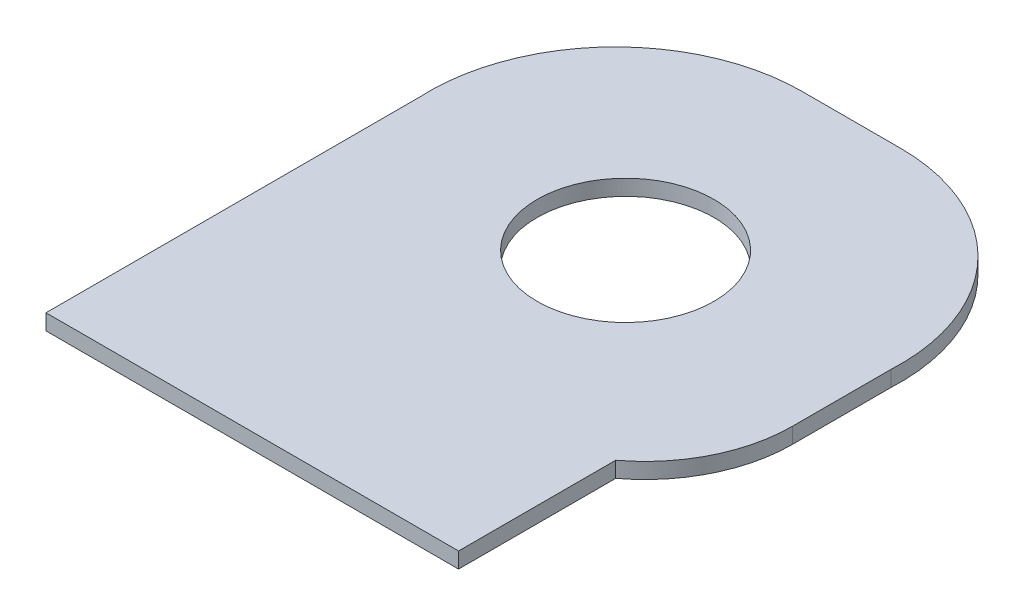
ISO-10303-21;
HEADER;
FILE_DESCRIPTION(('STEP AP214'),'2;1');
FILE_NAME('part.step','',(''),(''),'','','');
FILE_SCHEMA(('AUTOMOTIVE_DESIGN { 1 0 10303 214 1 1 1 1 }'));
ENDSEC;
DATA;
#1=APPLICATION_CONTEXT('core data for automotive mechanical design processes');
#2=APPLICATION_PROTOCOL_DEFINITION('international standard','automotive_design',2000,#1);
#3=PRODUCT_CONTEXT('',#1,'mechanical');
#4=PRODUCT('Part','Part','',(#3));
#5=PRODUCT_RELATED_PRODUCT_CATEGORY('part','',(#4));
#6=PRODUCT_DEFINITION_FORMATION('','',#4);
#7=PRODUCT_DEFINITION_CONTEXT('part definition',#1,'design');
#8=PRODUCT_DEFINITION('design','',#6,#7);
#9=PRODUCT_DEFINITION_SHAPE('','',#8);
#10=(LENGTH_UNIT() NAMED_UNIT(*) SI_UNIT(.MILLI.,.METRE.));
#11=(NAMED_UNIT(*) PLANE_ANGLE_UNIT() SI_UNIT($,.RADIAN.));
#12=(NAMED_UNIT(*) SI_UNIT($,.STERADIAN.) SOLID_ANGLE_UNIT());
#13=UNCERTAINTY_MEASURE_WITH_UNIT(LENGTH_MEASURE(1.E-05),#10,'distance_accuracy_value','');
#14=(GEOMETRIC_REPRESENTATION_CONTEXT(3) GLOBAL_UNCERTAINTY_ASSIGNED_CONTEXT((#13)) GLOBAL_UNIT_ASSIGNED_CONTEXT((#10,
#11,#12)) REPRESENTATION_CONTEXT('',''));
#15=CARTESIAN_POINT('',(0.,0.,0.));
#16=DIRECTION('',(0.,0.,1.));
#17=DIRECTION('',(1.,0.,0.));
#18=AXIS2_PLACEMENT_3D('',#15,#16,#17);
#19=CARTESIAN_POINT('',(-5.,1.6,-9.975));
#20=DIRECTION('',(0.,1.,0.));
#21=DIRECTION('',(0.,0.,1.));
#22=AXIS2_PLACEMENT_3D('',#19,#20,#21);
#23=PLANE('',#22);
#24=CARTESIAN_POINT('',(-5.,1.6,-9.975));
#25=DIRECTION('',(0.,1.,0.));
#26=DIRECTION('',(0.,0.,1.));
#27=AXIS2_PLACEMENT_3D('',#24,#25,#26);
#28=CIRCLE('',#27,19.025);
#29=CARTESIAN_POINT('',(-5.,1.6,-29.));
#30=VERTEX_POINT('',#29);
#31=CARTESIAN_POINT('',(-24.,1.6,-9.));
#32=VERTEX_POINT('',#31);
#33=EDGE_CURVE('E144',#30,#32,#28,.T.);
#34=ORIENTED_EDGE('',*,*,#33,.T.);
#35=DIRECTION('',(0.,0.,1.));
#36=VECTOR('',#35,1.);
#37=CARTESIAN_POINT('',(-24.,1.6,-9.));
#38=LINE('',#37,#36);
#39=CARTESIAN_POINT('',(-24.,1.6,29.));
#40=VERTEX_POINT('',#39);
#41=EDGE_CURVE('E92',#32,#40,#38,.T.);
#42=ORIENTED_EDGE('',*,*,#41,.T.);
#43=DIRECTION('',(1.,0.,0.));
#44=VECTOR('',#43,1.);
#45=CARTESIAN_POINT('',(-24.,1.6,29.));
#46=LINE('',#45,#44);
#47=CARTESIAN_POINT('',(18.,1.6,29.));
#48=VERTEX_POINT('',#47);
#49=EDGE_CURVE('E159',#40,#48,#46,.T.);
#50=ORIENTED_EDGE('',*,*,#49,.T.);
#51=DIRECTION('',(0.,0.,-1.));
#52=VECTOR('',#51,1.);
#53=CARTESIAN_POINT('',(18.,1.6,29.));
#54=LINE('',#53,#52);
#55=CARTESIAN_POINT('',(18.,1.6,13.));
#56=VERTEX_POINT('',#55);
#57=EDGE_CURVE('E172',#48,#56,#54,.T.);
#58=ORIENTED_EDGE('',*,*,#57,.T.);
#59=CARTESIAN_POINT('',(8.99999999999997,1.6,0.99999999999999));
#60=DIRECTION('',(0.,1.,0.));
#61=DIRECTION('',(0.,0.,-1.));
#62=AXIS2_PLACEMENT_3D('',#59,#60,#61);
#63=CIRCLE('',#62,15.);
#64=CARTESIAN_POINT('',(24.,1.6,0.999999999999996));
#65=VERTEX_POINT('',#64);
#66=EDGE_CURVE('E111',#56,#65,#63,.T.);
#67=ORIENTED_EDGE('',*,*,#66,.T.);
#68=DIRECTION('',(0.,0.,-1.));
#69=VECTOR('',#68,1.);
#70=CARTESIAN_POINT('',(24.,1.6,0.999999999999997));
#71=LINE('',#70,#69);
#72=CARTESIAN_POINT('',(24.,1.6,-9.));
#73=VERTEX_POINT('',#72);
#74=EDGE_CURVE('E105',#65,#73,#71,.T.);
#75=ORIENTED_EDGE('',*,*,#74,.T.);
#76=CARTESIAN_POINT('',(5.,1.6,-9.97500000000001));
#77=DIRECTION('',(0.,1.,0.));
#78=DIRECTION('',(0.,0.,-1.));
#79=AXIS2_PLACEMENT_3D('',#76,#77,#78);
#80=CIRCLE('',#79,19.025);
#81=CARTESIAN_POINT('',(5.,1.6,-29.));
#82=VERTEX_POINT('',#81);
#83=EDGE_CURVE('E109',#73,#82,#80,.T.);
#84=ORIENTED_EDGE('',*,*,#83,.T.);
#85=DIRECTION('',(-1.,0.,0.));
#86=VECTOR('',#85,1.);
#87=CARTESIAN_POINT('',(-5.,1.6,-29.));
#88=LINE('',#87,#86);
#89=EDGE_CURVE('E49',#82,#30,#88,.T.);
#90=ORIENTED_EDGE('',*,*,#89,.T.);
#91=EDGE_LOOP('',(#34,#42,#50,#58,#67,#75,#84,#90));
#92=FACE_BOUND('',#91,.T.);
#93=CARTESIAN_POINT('',(0.,1.6,-6.));
#94=DIRECTION('',(0.,1.,0.));
#95=DIRECTION('',(0.,0.,1.));
#96=AXIS2_PLACEMENT_3D('',#93,#94,#95);
#97=CIRCLE('',#96,8.99999999999999);
#98=CARTESIAN_POINT('',(0.,1.6,2.99999999999999));
#99=VERTEX_POINT('',#98);
#100=EDGE_CURVE('E133',#99,#99,#97,.T.);
#101=ORIENTED_EDGE('',*,*,#100,.F.);
#102=EDGE_LOOP('',(#101));
#103=FACE_BOUND('',#102,.T.);
#104=ADVANCED_FACE('F32',(#92,#103),#23,.T.);
#105=CARTESIAN_POINT('',(-5.,0.,-9.975));
#106=DIRECTION('',(0.,1.,0.));
#107=DIRECTION('',(0.,0.,1.));
#108=AXIS2_PLACEMENT_3D('',#105,#106,#107);
#109=PLANE('',#108);
#110=CARTESIAN_POINT('',(-5.,0.,-9.975));
#111=DIRECTION('',(0.,1.,0.));
#112=DIRECTION('',(0.,0.,1.));
#113=AXIS2_PLACEMENT_3D('',#110,#111,#112);
#114=CIRCLE('',#113,19.025);
#115=CARTESIAN_POINT('',(-5.,0.,-29.));
#116=VERTEX_POINT('',#115);
#117=CARTESIAN_POINT('',(-24.,0.,-9.));
#118=VERTEX_POINT('',#117);
#119=EDGE_CURVE('E129',#116,#118,#114,.T.);
#120=ORIENTED_EDGE('',*,*,#119,.F.);
#121=DIRECTION('',(-1.,0.,0.));
#122=VECTOR('',#121,1.);
#123=CARTESIAN_POINT('',(-5.,0.,-29.));
#124=LINE('',#123,#122);
#125=CARTESIAN_POINT('',(5.,0.,-29.));
#126=VERTEX_POINT('',#125);
#127=EDGE_CURVE('E84',#126,#116,#124,.T.);
#128=ORIENTED_EDGE('',*,*,#127,.F.);
#129=CARTESIAN_POINT('',(5.,0.,-9.97500000000001));
#130=DIRECTION('',(0.,1.,0.));
#131=DIRECTION('',(0.,0.,-1.));
#132=AXIS2_PLACEMENT_3D('',#129,#130,#131);
#133=CIRCLE('',#132,19.025);
#134=CARTESIAN_POINT('',(24.,0.,-9.));
#135=VERTEX_POINT('',#134);
#136=EDGE_CURVE('E78',#135,#126,#133,.T.);
#137=ORIENTED_EDGE('',*,*,#136,.F.);
#138=DIRECTION('',(0.,0.,-1.));
#139=VECTOR('',#138,1.);
#140=CARTESIAN_POINT('',(24.,0.,0.999999999999997));
#141=LINE('',#140,#139);
#142=CARTESIAN_POINT('',(24.,0.,0.999999999999996));
#143=VERTEX_POINT('',#142);
#144=EDGE_CURVE('E119',#143,#135,#141,.T.);
#145=ORIENTED_EDGE('',*,*,#144,.F.);
#146=CARTESIAN_POINT('',(8.99999999999997,0.,0.99999999999999));
#147=DIRECTION('',(0.,1.,0.));
#148=DIRECTION('',(0.,0.,-1.));
#149=AXIS2_PLACEMENT_3D('',#146,#147,#148);
#150=CIRCLE('',#149,15.);
#151=CARTESIAN_POINT('',(18.,0.,13.));
#152=VERTEX_POINT('',#151);
#153=EDGE_CURVE('E139',#152,#143,#150,.T.);
#154=ORIENTED_EDGE('',*,*,#153,.F.);
#155=DIRECTION('',(0.,0.,-1.));
#156=VECTOR('',#155,1.);
#157=CARTESIAN_POINT('',(18.,0.,29.));
#158=LINE('',#157,#156);
#159=CARTESIAN_POINT('',(18.,0.,29.));
#160=VERTEX_POINT('',#159);
#161=EDGE_CURVE('E137',#160,#152,#158,.T.);
#162=ORIENTED_EDGE('',*,*,#161,.F.);
#163=DIRECTION('',(1.,0.,0.));
#164=VECTOR('',#163,1.);
#165=CARTESIAN_POINT('',(-24.,0.,29.));
#166=LINE('',#165,#164);
#167=CARTESIAN_POINT('',(-24.,0.,29.));
#168=VERTEX_POINT('',#167);
#169=EDGE_CURVE('E135',#168,#160,#166,.T.);
#170=ORIENTED_EDGE('',*,*,#169,.F.);
#171=DIRECTION('',(0.,0.,1.));
#172=VECTOR('',#171,1.);
#173=CARTESIAN_POINT('',(-24.,0.,-9.));
#174=LINE('',#173,#172);
#175=EDGE_CURVE('E132',#118,#168,#174,.T.);
#176=ORIENTED_EDGE('',*,*,#175,.F.);
#177=EDGE_LOOP('',(#120,#128,#137,#145,#154,#162,#170,#176));
#178=FACE_BOUND('',#177,.T.);
#179=CARTESIAN_POINT('',(0.,0.,-6.));
#180=DIRECTION('',(0.,1.,0.));
#181=DIRECTION('',(0.,0.,1.));
#182=AXIS2_PLACEMENT_3D('',#179,#180,#181);
#183=CIRCLE('',#182,8.99999999999999);
#184=CARTESIAN_POINT('',(0.,0.,2.99999999999999));
#185=VERTEX_POINT('',#184);
#186=EDGE_CURVE('E178',#185,#185,#183,.T.);
#187=ORIENTED_EDGE('',*,*,#186,.T.);
#188=EDGE_LOOP('',(#187));
#189=FACE_BOUND('',#188,.T.);
#190=ADVANCED_FACE('F163',(#178,#189),#109,.F.);
#191=CARTESIAN_POINT('',(-5.,1.6,-9.975));
#192=DIRECTION('',(0.,-1.,0.));
#193=DIRECTION('',(0.,0.,-1.));
#194=AXIS2_PLACEMENT_3D('',#191,#192,#193);
#195=CYLINDRICAL_SURFACE('',#194,19.025);
#196=ORIENTED_EDGE('',*,*,#119,.T.);
#197=DIRECTION('',(0.,-1.,0.));
#198=VECTOR('',#197,1.);
#199=CARTESIAN_POINT('',(-24.,1.6,-9.));
#200=LINE('',#199,#198);
#201=EDGE_CURVE('E11',#32,#118,#200,.T.);
#202=ORIENTED_EDGE('',*,*,#201,.F.);
#203=ORIENTED_EDGE('',*,*,#33,.F.);
#204=DIRECTION('',(0.,-1.,0.));
#205=VECTOR('',#204,1.);
#206=CARTESIAN_POINT('',(-5.,1.6,-29.));
#207=LINE('',#206,#205);
#208=EDGE_CURVE('E125',#30,#116,#207,.T.);
#209=ORIENTED_EDGE('',*,*,#208,.T.);
#210=EDGE_LOOP('',(#196,#202,#203,#209));
#211=FACE_BOUND('',#210,.T.);
#212=ADVANCED_FACE('F34',(#211),#195,.T.);
#213=CARTESIAN_POINT('',(-24.,1.6,-9.));
#214=DIRECTION('',(1.,0.,0.));
#215=DIRECTION('',(0.,0.,-1.));
#216=AXIS2_PLACEMENT_3D('',#213,#214,#215);
#217=PLANE('',#216);
#218=ORIENTED_EDGE('',*,*,#175,.T.);
#219=DIRECTION('',(0.,-1.,0.));
#220=VECTOR('',#219,1.);
#221=CARTESIAN_POINT('',(-24.,1.6,29.));
#222=LINE('',#221,#220);
#223=EDGE_CURVE('E41',#40,#168,#222,.T.);
#224=ORIENTED_EDGE('',*,*,#223,.F.);
#225=ORIENTED_EDGE('',*,*,#41,.F.);
#226=ORIENTED_EDGE('',*,*,#201,.T.);
#227=EDGE_LOOP('',(#218,#224,#225,#226));
#228=FACE_BOUND('',#227,.T.);
#229=ADVANCED_FACE('F206',(#228),#217,.F.);
#230=CARTESIAN_POINT('',(-24.,1.6,29.));
#231=DIRECTION('',(0.,0.,-1.));
#232=DIRECTION('',(-1.,0.,0.));
#233=AXIS2_PLACEMENT_3D('',#230,#231,#232);
#234=PLANE('',#233);
#235=ORIENTED_EDGE('',*,*,#169,.T.);
#236=DIRECTION('',(0.,-1.,0.));
#237=VECTOR('',#236,1.);
#238=CARTESIAN_POINT('',(18.,1.6,29.));
#239=LINE('',#238,#237);
#240=EDGE_CURVE('E151',#48,#160,#239,.T.);
#241=ORIENTED_EDGE('',*,*,#240,.F.);
#242=ORIENTED_EDGE('',*,*,#49,.F.);
#243=ORIENTED_EDGE('',*,*,#223,.T.);
#244=EDGE_LOOP('',(#235,#241,#242,#243));
#245=FACE_BOUND('',#244,.T.);
#246=ADVANCED_FACE('F157',(#245),#234,.F.);
#247=CARTESIAN_POINT('',(18.,1.6,29.));
#248=DIRECTION('',(-1.,0.,0.));
#249=DIRECTION('',(0.,0.,1.));
#250=AXIS2_PLACEMENT_3D('',#247,#248,#249);
#251=PLANE('',#250);
#252=ORIENTED_EDGE('',*,*,#161,.T.);
#253=DIRECTION('',(0.,-1.,0.));
#254=VECTOR('',#253,1.);
#255=CARTESIAN_POINT('',(18.,1.6,13.));
#256=LINE('',#255,#254);
#257=EDGE_CURVE('E148',#56,#152,#256,.T.);
#258=ORIENTED_EDGE('',*,*,#257,.F.);
#259=ORIENTED_EDGE('',*,*,#57,.F.);
#260=ORIENTED_EDGE('',*,*,#240,.T.);
#261=EDGE_LOOP('',(#252,#258,#259,#260));
#262=FACE_BOUND('',#261,.T.);
#263=ADVANCED_FACE('F168',(#262),#251,.F.);
#264=CARTESIAN_POINT('',(8.99999999999997,1.6,0.99999999999999));
#265=DIRECTION('',(0.,-1.,0.));
#266=DIRECTION('',(0.,0.,-1.));
#267=AXIS2_PLACEMENT_3D('',#264,#265,#266);
#268=CYLINDRICAL_SURFACE('',#267,15.);
#269=ORIENTED_EDGE('',*,*,#153,.T.);
#270=DIRECTION('',(0.,-1.,0.));
#271=VECTOR('',#270,1.);
#272=CARTESIAN_POINT('',(24.,1.6,0.999999999999996));
#273=LINE('',#272,#271);
#274=EDGE_CURVE('E120',#65,#143,#273,.T.);
#275=ORIENTED_EDGE('',*,*,#274,.F.);
#276=ORIENTED_EDGE('',*,*,#66,.F.);
#277=ORIENTED_EDGE('',*,*,#257,.T.);
#278=EDGE_LOOP('',(#269,#275,#276,#277));
#279=FACE_BOUND('',#278,.T.);
#280=ADVANCED_FACE('F171',(#279),#268,.T.);
#281=CARTESIAN_POINT('',(24.,1.6,0.999999999999997));
#282=DIRECTION('',(-1.,0.,0.));
#283=DIRECTION('',(0.,0.,1.));
#284=AXIS2_PLACEMENT_3D('',#281,#282,#283);
#285=PLANE('',#284);
#286=ORIENTED_EDGE('',*,*,#144,.T.);
#287=DIRECTION('',(0.,-1.,0.));
#288=VECTOR('',#287,1.);
#289=CARTESIAN_POINT('',(24.,1.6,-9.));
#290=LINE('',#289,#288);
#291=EDGE_CURVE('E116',#73,#135,#290,.T.);
#292=ORIENTED_EDGE('',*,*,#291,.F.);
#293=ORIENTED_EDGE('',*,*,#74,.F.);
#294=ORIENTED_EDGE('',*,*,#274,.T.);
#295=EDGE_LOOP('',(#286,#292,#293,#294));
#296=FACE_BOUND('',#295,.T.);
#297=ADVANCED_FACE('F117',(#296),#285,.F.);
#298=CARTESIAN_POINT('',(5.,1.6,-9.97500000000001));
#299=DIRECTION('',(0.,-1.,0.));
#300=DIRECTION('',(0.,0.,-1.));
#301=AXIS2_PLACEMENT_3D('',#298,#299,#300);
#302=CYLINDRICAL_SURFACE('',#301,19.025);
#303=ORIENTED_EDGE('',*,*,#136,.T.);
#304=DIRECTION('',(0.,-1.,0.));
#305=VECTOR('',#304,1.);
#306=CARTESIAN_POINT('',(5.,1.6,-29.));
#307=LINE('',#306,#305);
#308=EDGE_CURVE('E121',#82,#126,#307,.T.);
#309=ORIENTED_EDGE('',*,*,#308,.F.);
#310=ORIENTED_EDGE('',*,*,#83,.F.);
#311=ORIENTED_EDGE('',*,*,#291,.T.);
#312=EDGE_LOOP('',(#303,#309,#310,#311));
#313=FACE_BOUND('',#312,.T.);
#314=ADVANCED_FACE('F123',(#313),#302,.T.);
#315=CARTESIAN_POINT('',(-5.,1.6,-29.));
#316=DIRECTION('',(0.,0.,1.));
#317=DIRECTION('',(1.,0.,0.));
#318=AXIS2_PLACEMENT_3D('',#315,#316,#317);
#319=PLANE('',#318);
#320=ORIENTED_EDGE('',*,*,#127,.T.);
#321=ORIENTED_EDGE('',*,*,#208,.F.);
#322=ORIENTED_EDGE('',*,*,#89,.F.);
#323=ORIENTED_EDGE('',*,*,#308,.T.);
#324=EDGE_LOOP('',(#320,#321,#322,#323));
#325=FACE_BOUND('',#324,.T.);
#326=ADVANCED_FACE('F194',(#325),#319,.F.);
#327=CARTESIAN_POINT('',(0.,1.6,-6.));
#328=DIRECTION('',(0.,-1.,0.));
#329=DIRECTION('',(0.,0.,-1.));
#330=AXIS2_PLACEMENT_3D('',#327,#328,#329);
#331=CYLINDRICAL_SURFACE('',#330,8.99999999999999);
#332=ORIENTED_EDGE('',*,*,#100,.T.);
#333=EDGE_LOOP('',(#332));
#334=FACE_BOUND('',#333,.T.);
#335=ORIENTED_EDGE('',*,*,#186,.F.);
#336=EDGE_LOOP('',(#335));
#337=FACE_BOUND('',#336,.T.);
#338=ADVANCED_FACE('F184',(#334,#337),#331,.F.);
#339=CLOSED_SHELL('',(#104,#190,#212,#229,#246,#263,#280,#297,#314,#326,#338));
#340=MANIFOLD_SOLID_BREP('B2',#339);
#341=ADVANCED_BREP_SHAPE_REPRESENTATION('',(#18,#340),#14);
#342=SHAPE_DEFINITION_REPRESENTATION(#9,#341);
ENDSEC;
END-ISO-10303-21;
